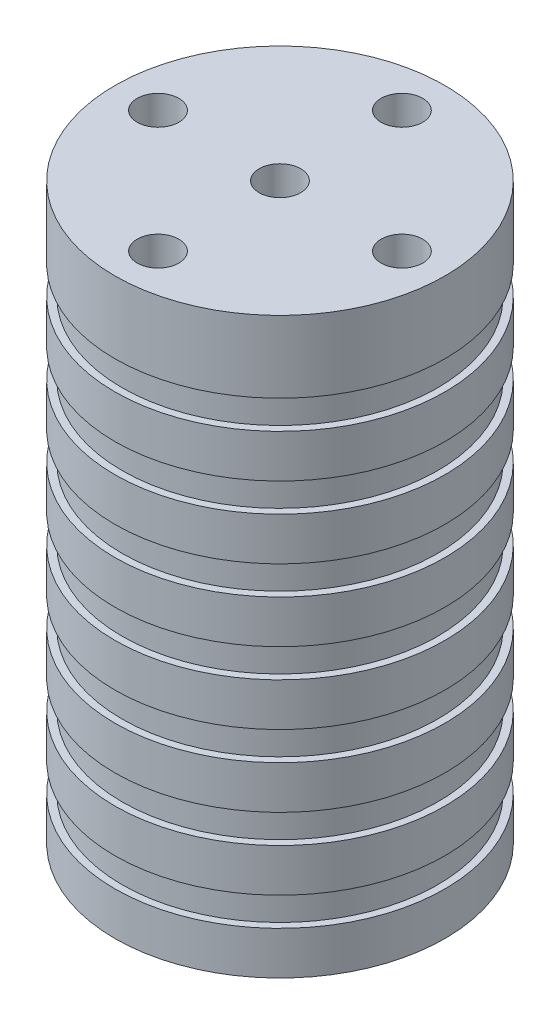
ISO-10303-21;
HEADER;
FILE_DESCRIPTION(('STEP AP214'),'2;1');
FILE_NAME('part.step','',(''),(''),'','','');
FILE_SCHEMA(('AUTOMOTIVE_DESIGN { 1 0 10303 214 1 1 1 1 }'));
ENDSEC;
DATA;
#1=APPLICATION_CONTEXT('core data for automotive mechanical design processes');
#2=APPLICATION_PROTOCOL_DEFINITION('international standard','automotive_design',2000,#1);
#3=PRODUCT_CONTEXT('',#1,'mechanical');
#4=PRODUCT('Part','Part','',(#3));
#5=PRODUCT_RELATED_PRODUCT_CATEGORY('part','',(#4));
#6=PRODUCT_DEFINITION_FORMATION('','',#4);
#7=PRODUCT_DEFINITION_CONTEXT('part definition',#1,'design');
#8=PRODUCT_DEFINITION('design','',#6,#7);
#9=PRODUCT_DEFINITION_SHAPE('','',#8);
#10=(LENGTH_UNIT() NAMED_UNIT(*) SI_UNIT(.MILLI.,.METRE.));
#11=(NAMED_UNIT(*) PLANE_ANGLE_UNIT() SI_UNIT($,.RADIAN.));
#12=(NAMED_UNIT(*) SI_UNIT($,.STERADIAN.) SOLID_ANGLE_UNIT());
#13=UNCERTAINTY_MEASURE_WITH_UNIT(LENGTH_MEASURE(1.E-05),#10,'distance_accuracy_value','');
#14=(GEOMETRIC_REPRESENTATION_CONTEXT(3) GLOBAL_UNCERTAINTY_ASSIGNED_CONTEXT((#13)) GLOBAL_UNIT_ASSIGNED_CONTEXT((#10,
#11,#12)) REPRESENTATION_CONTEXT('',''));
#15=CARTESIAN_POINT('',(0.,0.,0.));
#16=DIRECTION('',(0.,0.,1.));
#17=DIRECTION('',(1.,0.,0.));
#18=AXIS2_PLACEMENT_3D('',#15,#16,#17);
#19=CARTESIAN_POINT('',(0.,0.,0.));
#20=DIRECTION('',(0.,-1.,0.));
#21=DIRECTION('',(0.,0.,-1.));
#22=AXIS2_PLACEMENT_3D('',#19,#20,#21);
#23=PLANE('',#22);
#24=CARTESIAN_POINT('',(8.5,0.,0.));
#25=DIRECTION('',(0.,1.,0.));
#26=DIRECTION('',(0.,0.,1.));
#27=AXIS2_PLACEMENT_3D('',#24,#25,#26);
#28=CIRCLE('',#27,1.45);
#29=CARTESIAN_POINT('',(8.5,0.,1.44999999999999));
#30=VERTEX_POINT('',#29);
#31=EDGE_CURVE('E84',#30,#30,#28,.T.);
#32=ORIENTED_EDGE('',*,*,#31,.F.);
#33=EDGE_LOOP('',(#32));
#34=FACE_BOUND('',#33,.T.);
#35=CARTESIAN_POINT('',(0.,0.,0.));
#36=DIRECTION('',(0.,1.,0.));
#37=DIRECTION('',(0.,0.,1.));
#38=AXIS2_PLACEMENT_3D('',#35,#36,#37);
#39=CIRCLE('',#38,1.45);
#40=CARTESIAN_POINT('',(0.,0.,1.45));
#41=VERTEX_POINT('',#40);
#42=EDGE_CURVE('E83',#41,#41,#39,.T.);
#43=ORIENTED_EDGE('',*,*,#42,.F.);
#44=EDGE_LOOP('',(#43));
#45=FACE_BOUND('',#44,.T.);
#46=CARTESIAN_POINT('',(0.,0.,-8.5));
#47=DIRECTION('',(0.,1.,0.));
#48=DIRECTION('',(0.,0.,1.));
#49=AXIS2_PLACEMENT_3D('',#46,#47,#48);
#50=CIRCLE('',#49,1.45);
#51=CARTESIAN_POINT('',(0.,0.,-7.05));
#52=VERTEX_POINT('',#51);
#53=EDGE_CURVE('E100',#52,#52,#50,.T.);
#54=ORIENTED_EDGE('',*,*,#53,.F.);
#55=EDGE_LOOP('',(#54));
#56=FACE_BOUND('',#55,.T.);
#57=CARTESIAN_POINT('',(0.,0.,8.5));
#58=DIRECTION('',(0.,1.,0.));
#59=DIRECTION('',(0.,0.,1.));
#60=AXIS2_PLACEMENT_3D('',#57,#58,#59);
#61=CIRCLE('',#60,1.45);
#62=CARTESIAN_POINT('',(0.,0.,9.95));
#63=VERTEX_POINT('',#62);
#64=EDGE_CURVE('E106',#63,#63,#61,.T.);
#65=ORIENTED_EDGE('',*,*,#64,.F.);
#66=EDGE_LOOP('',(#65));
#67=FACE_BOUND('',#66,.T.);
#68=CARTESIAN_POINT('',(0.,0.,0.));
#69=DIRECTION('',(0.,1.,0.));
#70=DIRECTION('',(0.,0.,1.));
#71=AXIS2_PLACEMENT_3D('',#68,#69,#70);
#72=CIRCLE('',#71,11.5);
#73=CARTESIAN_POINT('',(0.,0.,11.5));
#74=VERTEX_POINT('',#73);
#75=EDGE_CURVE('E60',#74,#74,#72,.T.);
#76=ORIENTED_EDGE('',*,*,#75,.T.);
#77=EDGE_LOOP('',(#76));
#78=FACE_BOUND('',#77,.T.);
#79=CARTESIAN_POINT('',(-8.5,0.,0.));
#80=DIRECTION('',(0.,1.,0.));
#81=DIRECTION('',(0.,0.,1.));
#82=AXIS2_PLACEMENT_3D('',#79,#80,#81);
#83=CIRCLE('',#82,1.45);
#84=CARTESIAN_POINT('',(-8.5,0.,1.45));
#85=VERTEX_POINT('',#84);
#86=EDGE_CURVE('E94',#85,#85,#83,.T.);
#87=ORIENTED_EDGE('',*,*,#86,.F.);
#88=EDGE_LOOP('',(#87));
#89=FACE_BOUND('',#88,.T.);
#90=ADVANCED_FACE('F52',(#34,#45,#56,#67,#78,#89),#23,.F.);
#91=CARTESIAN_POINT('',(0.,0.,0.));
#92=DIRECTION('',(0.,1.,0.));
#93=DIRECTION('',(0.,0.,1.));
#94=AXIS2_PLACEMENT_3D('',#91,#92,#93);
#95=CYLINDRICAL_SURFACE('',#94,11.5);
#96=CARTESIAN_POINT('',(0.,-7.,0.));
#97=DIRECTION('',(0.,1.,0.));
#98=DIRECTION('',(0.,0.,1.));
#99=AXIS2_PLACEMENT_3D('',#96,#97,#98);
#100=CIRCLE('',#99,11.5);
#101=CARTESIAN_POINT('',(0.,-7.,11.5));
#102=VERTEX_POINT('',#101);
#103=EDGE_CURVE('E121',#102,#102,#100,.T.);
#104=ORIENTED_EDGE('',*,*,#103,.F.);
#105=EDGE_LOOP('',(#104));
#106=FACE_BOUND('',#105,.T.);
#107=CARTESIAN_POINT('',(0.,-9.99999999999999,0.));
#108=DIRECTION('',(0.,1.,0.));
#109=DIRECTION('',(0.,0.,1.));
#110=AXIS2_PLACEMENT_3D('',#107,#108,#109);
#111=CIRCLE('',#110,11.5);
#112=CARTESIAN_POINT('',(0.,-9.99999999999999,11.5));
#113=VERTEX_POINT('',#112);
#114=EDGE_CURVE('E124',#113,#113,#111,.T.);
#115=ORIENTED_EDGE('',*,*,#114,.T.);
#116=EDGE_LOOP('',(#115));
#117=FACE_BOUND('',#116,.T.);
#118=ADVANCED_FACE('F212',(#106,#117),#95,.T.);
#119=CARTESIAN_POINT('',(0.,-12.,0.));
#120=DIRECTION('',(0.,1.,0.));
#121=DIRECTION('',(0.,0.,1.));
#122=AXIS2_PLACEMENT_3D('',#119,#120,#121);
#123=CIRCLE('',#122,11.5);
#124=CARTESIAN_POINT('',(0.,-12.,11.5));
#125=VERTEX_POINT('',#124);
#126=EDGE_CURVE('E133',#125,#125,#123,.T.);
#127=ORIENTED_EDGE('',*,*,#126,.F.);
#128=EDGE_LOOP('',(#127));
#129=FACE_BOUND('',#128,.T.);
#130=CARTESIAN_POINT('',(0.,-15.,0.));
#131=DIRECTION('',(0.,1.,0.));
#132=DIRECTION('',(0.,0.,1.));
#133=AXIS2_PLACEMENT_3D('',#130,#131,#132);
#134=CIRCLE('',#133,11.5);
#135=CARTESIAN_POINT('',(0.,-15.,11.5));
#136=VERTEX_POINT('',#135);
#137=EDGE_CURVE('E136',#136,#136,#134,.T.);
#138=ORIENTED_EDGE('',*,*,#137,.T.);
#139=EDGE_LOOP('',(#138));
#140=FACE_BOUND('',#139,.T.);
#141=ADVANCED_FACE('F227',(#129,#140),#95,.T.);
#142=CARTESIAN_POINT('',(0.,-17.,0.));
#143=DIRECTION('',(0.,1.,0.));
#144=DIRECTION('',(0.,0.,1.));
#145=AXIS2_PLACEMENT_3D('',#142,#143,#144);
#146=CIRCLE('',#145,11.5);
#147=CARTESIAN_POINT('',(0.,-17.,11.5));
#148=VERTEX_POINT('',#147);
#149=EDGE_CURVE('E145',#148,#148,#146,.T.);
#150=ORIENTED_EDGE('',*,*,#149,.F.);
#151=EDGE_LOOP('',(#150));
#152=FACE_BOUND('',#151,.T.);
#153=CARTESIAN_POINT('',(0.,-20.,0.));
#154=DIRECTION('',(0.,1.,0.));
#155=DIRECTION('',(0.,0.,1.));
#156=AXIS2_PLACEMENT_3D('',#153,#154,#155);
#157=CIRCLE('',#156,11.5);
#158=CARTESIAN_POINT('',(0.,-20.,11.5));
#159=VERTEX_POINT('',#158);
#160=EDGE_CURVE('E148',#159,#159,#157,.T.);
#161=ORIENTED_EDGE('',*,*,#160,.T.);
#162=EDGE_LOOP('',(#161));
#163=FACE_BOUND('',#162,.T.);
#164=ADVANCED_FACE('F390',(#152,#163),#95,.T.);
#165=CARTESIAN_POINT('',(0.,-22.,0.));
#166=DIRECTION('',(0.,1.,0.));
#167=DIRECTION('',(0.,0.,1.));
#168=AXIS2_PLACEMENT_3D('',#165,#166,#167);
#169=CIRCLE('',#168,11.5);
#170=CARTESIAN_POINT('',(0.,-22.,11.5));
#171=VERTEX_POINT('',#170);
#172=EDGE_CURVE('E157',#171,#171,#169,.T.);
#173=ORIENTED_EDGE('',*,*,#172,.F.);
#174=EDGE_LOOP('',(#173));
#175=FACE_BOUND('',#174,.T.);
#176=CARTESIAN_POINT('',(0.,-25.,0.));
#177=DIRECTION('',(0.,1.,0.));
#178=DIRECTION('',(0.,0.,1.));
#179=AXIS2_PLACEMENT_3D('',#176,#177,#178);
#180=CIRCLE('',#179,11.5);
#181=CARTESIAN_POINT('',(0.,-25.,11.5));
#182=VERTEX_POINT('',#181);
#183=EDGE_CURVE('E160',#182,#182,#180,.T.);
#184=ORIENTED_EDGE('',*,*,#183,.T.);
#185=EDGE_LOOP('',(#184));
#186=FACE_BOUND('',#185,.T.);
#187=ADVANCED_FACE('F397',(#175,#186),#95,.T.);
#188=CARTESIAN_POINT('',(0.,-27.,0.));
#189=DIRECTION('',(0.,1.,0.));
#190=DIRECTION('',(0.,0.,1.));
#191=AXIS2_PLACEMENT_3D('',#188,#189,#190);
#192=CIRCLE('',#191,11.5);
#193=CARTESIAN_POINT('',(0.,-27.,11.5));
#194=VERTEX_POINT('',#193);
#195=EDGE_CURVE('E169',#194,#194,#192,.T.);
#196=ORIENTED_EDGE('',*,*,#195,.F.);
#197=EDGE_LOOP('',(#196));
#198=FACE_BOUND('',#197,.T.);
#199=CARTESIAN_POINT('',(0.,-30.,0.));
#200=DIRECTION('',(0.,1.,0.));
#201=DIRECTION('',(0.,0.,1.));
#202=AXIS2_PLACEMENT_3D('',#199,#200,#201);
#203=CIRCLE('',#202,11.5);
#204=CARTESIAN_POINT('',(0.,-30.,11.5));
#205=VERTEX_POINT('',#204);
#206=EDGE_CURVE('E172',#205,#205,#203,.T.);
#207=ORIENTED_EDGE('',*,*,#206,.T.);
#208=EDGE_LOOP('',(#207));
#209=FACE_BOUND('',#208,.T.);
#210=ADVANCED_FACE('F404',(#198,#209),#95,.T.);
#211=CARTESIAN_POINT('',(0.,-32.,0.));
#212=DIRECTION('',(0.,1.,0.));
#213=DIRECTION('',(0.,0.,1.));
#214=AXIS2_PLACEMENT_3D('',#211,#212,#213);
#215=CIRCLE('',#214,11.5);
#216=CARTESIAN_POINT('',(0.,-32.,11.5));
#217=VERTEX_POINT('',#216);
#218=EDGE_CURVE('E181',#217,#217,#215,.T.);
#219=ORIENTED_EDGE('',*,*,#218,.F.);
#220=EDGE_LOOP('',(#219));
#221=FACE_BOUND('',#220,.T.);
#222=CARTESIAN_POINT('',(0.,-35.,0.));
#223=DIRECTION('',(0.,1.,0.));
#224=DIRECTION('',(0.,0.,1.));
#225=AXIS2_PLACEMENT_3D('',#222,#223,#224);
#226=CIRCLE('',#225,11.5);
#227=CARTESIAN_POINT('',(0.,-35.,11.5));
#228=VERTEX_POINT('',#227);
#229=EDGE_CURVE('E184',#228,#228,#226,.T.);
#230=ORIENTED_EDGE('',*,*,#229,.T.);
#231=EDGE_LOOP('',(#230));
#232=FACE_BOUND('',#231,.T.);
#233=ADVANCED_FACE('F230',(#221,#232),#95,.T.);
#234=CARTESIAN_POINT('',(0.,-37.,0.));
#235=DIRECTION('',(0.,1.,0.));
#236=DIRECTION('',(0.,0.,1.));
#237=AXIS2_PLACEMENT_3D('',#234,#235,#236);
#238=CIRCLE('',#237,11.5);
#239=CARTESIAN_POINT('',(0.,-37.,11.5));
#240=VERTEX_POINT('',#239);
#241=EDGE_CURVE('E193',#240,#240,#238,.T.);
#242=ORIENTED_EDGE('',*,*,#241,.F.);
#243=EDGE_LOOP('',(#242));
#244=FACE_BOUND('',#243,.T.);
#245=CARTESIAN_POINT('',(0.,-40.,0.));
#246=DIRECTION('',(0.,1.,0.));
#247=DIRECTION('',(0.,0.,1.));
#248=AXIS2_PLACEMENT_3D('',#245,#246,#247);
#249=CIRCLE('',#248,11.5);
#250=CARTESIAN_POINT('',(0.,-40.,11.5));
#251=VERTEX_POINT('',#250);
#252=EDGE_CURVE('E199',#251,#251,#249,.T.);
#253=ORIENTED_EDGE('',*,*,#252,.T.);
#254=EDGE_LOOP('',(#253));
#255=FACE_BOUND('',#254,.T.);
#256=ADVANCED_FACE('F213',(#244,#255),#95,.T.);
#257=CARTESIAN_POINT('',(0.,0.,0.));
#258=DIRECTION('',(0.,1.,0.));
#259=DIRECTION('',(0.,0.,1.));
#260=AXIS2_PLACEMENT_3D('',#257,#258,#259);
#261=CYLINDRICAL_SURFACE('',#260,5.5);
#262=CARTESIAN_POINT('',(0.,-7.,0.));
#263=DIRECTION('',(0.,1.,0.));
#264=DIRECTION('',(0.,0.,1.));
#265=AXIS2_PLACEMENT_3D('',#262,#263,#264);
#266=CIRCLE('',#265,5.5);
#267=CARTESIAN_POINT('',(0.,-7.,5.5));
#268=VERTEX_POINT('',#267);
#269=EDGE_CURVE('E11',#268,#268,#266,.T.);
#270=ORIENTED_EDGE('',*,*,#269,.T.);
#271=EDGE_LOOP('',(#270));
#272=FACE_BOUND('',#271,.T.);
#273=CARTESIAN_POINT('',(0.,-40.,0.));
#274=DIRECTION('',(0.,1.,0.));
#275=DIRECTION('',(0.,0.,1.));
#276=AXIS2_PLACEMENT_3D('',#273,#274,#275);
#277=CIRCLE('',#276,5.49999999999999);
#278=CARTESIAN_POINT('',(0.,-40.,5.49999999999999));
#279=VERTEX_POINT('',#278);
#280=EDGE_CURVE('E196',#279,#279,#277,.T.);
#281=ORIENTED_EDGE('',*,*,#280,.F.);
#282=EDGE_LOOP('',(#281));
#283=FACE_BOUND('',#282,.T.);
#284=ADVANCED_FACE('F54',(#272,#283),#261,.F.);
#285=CARTESIAN_POINT('',(0.,-7.,0.));
#286=DIRECTION('',(0.,-1.,0.));
#287=DIRECTION('',(0.,0.,-1.));
#288=AXIS2_PLACEMENT_3D('',#285,#286,#287);
#289=PLANE('',#288);
#290=CARTESIAN_POINT('',(0.,-7.,0.));
#291=DIRECTION('',(0.,-1.,0.));
#292=DIRECTION('',(0.,0.,-1.));
#293=AXIS2_PLACEMENT_3D('',#290,#291,#292);
#294=CIRCLE('',#293,1.45);
#295=CARTESIAN_POINT('',(0.,-7.,-1.45));
#296=VERTEX_POINT('',#295);
#297=EDGE_CURVE('E87',#296,#296,#294,.T.);
#298=ORIENTED_EDGE('',*,*,#297,.F.);
#299=EDGE_LOOP('',(#298));
#300=FACE_BOUND('',#299,.T.);
#301=ORIENTED_EDGE('',*,*,#269,.F.);
#302=EDGE_LOOP('',(#301));
#303=FACE_BOUND('',#302,.T.);
#304=ADVANCED_FACE('F239',(#300,#303),#289,.T.);
#305=CARTESIAN_POINT('',(0.,-40.,0.));
#306=DIRECTION('',(0.,-1.,0.));
#307=DIRECTION('',(0.,0.,-1.));
#308=AXIS2_PLACEMENT_3D('',#305,#306,#307);
#309=PLANE('',#308);
#310=ORIENTED_EDGE('',*,*,#280,.T.);
#311=EDGE_LOOP('',(#310));
#312=FACE_BOUND('',#311,.T.);
#313=ORIENTED_EDGE('',*,*,#252,.F.);
#314=EDGE_LOOP('',(#313));
#315=FACE_BOUND('',#314,.T.);
#316=ADVANCED_FACE('F241',(#312,#315),#309,.T.);
#317=CARTESIAN_POINT('',(11.5,-37.,0.));
#318=DIRECTION('',(0.,-1.,0.));
#319=DIRECTION('',(0.,0.,-1.));
#320=AXIS2_PLACEMENT_3D('',#317,#318,#319);
#321=PLANE('',#320);
#322=CARTESIAN_POINT('',(0.,-37.,0.));
#323=DIRECTION('',(0.,1.,0.));
#324=DIRECTION('',(0.,0.,1.));
#325=AXIS2_PLACEMENT_3D('',#322,#323,#324);
#326=CIRCLE('',#325,11.);
#327=CARTESIAN_POINT('',(0.,-37.,11.));
#328=VERTEX_POINT('',#327);
#329=EDGE_CURVE('E190',#328,#328,#326,.T.);
#330=ORIENTED_EDGE('',*,*,#329,.F.);
#331=EDGE_LOOP('',(#330));
#332=FACE_BOUND('',#331,.T.);
#333=ORIENTED_EDGE('',*,*,#241,.T.);
#334=EDGE_LOOP('',(#333));
#335=FACE_BOUND('',#334,.T.);
#336=ADVANCED_FACE('F246',(#332,#335),#321,.F.);
#337=CARTESIAN_POINT('',(0.,0.,0.));
#338=DIRECTION('',(0.,1.,0.));
#339=DIRECTION('',(0.,0.,1.));
#340=AXIS2_PLACEMENT_3D('',#337,#338,#339);
#341=CYLINDRICAL_SURFACE('',#340,11.);
#342=CARTESIAN_POINT('',(0.,-35.,0.));
#343=DIRECTION('',(0.,1.,0.));
#344=DIRECTION('',(0.,0.,1.));
#345=AXIS2_PLACEMENT_3D('',#342,#343,#344);
#346=CIRCLE('',#345,11.);
#347=CARTESIAN_POINT('',(0.,-35.,11.));
#348=VERTEX_POINT('',#347);
#349=EDGE_CURVE('E187',#348,#348,#346,.T.);
#350=ORIENTED_EDGE('',*,*,#349,.F.);
#351=EDGE_LOOP('',(#350));
#352=FACE_BOUND('',#351,.T.);
#353=ORIENTED_EDGE('',*,*,#329,.T.);
#354=EDGE_LOOP('',(#353));
#355=FACE_BOUND('',#354,.T.);
#356=ADVANCED_FACE('F351',(#352,#355),#341,.T.);
#357=CARTESIAN_POINT('',(11.,-35.,0.));
#358=DIRECTION('',(0.,1.,0.));
#359=DIRECTION('',(0.,0.,1.));
#360=AXIS2_PLACEMENT_3D('',#357,#358,#359);
#361=PLANE('',#360);
#362=ORIENTED_EDGE('',*,*,#229,.F.);
#363=EDGE_LOOP('',(#362));
#364=FACE_BOUND('',#363,.T.);
#365=ORIENTED_EDGE('',*,*,#349,.T.);
#366=EDGE_LOOP('',(#365));
#367=FACE_BOUND('',#366,.T.);
#368=ADVANCED_FACE('F347',(#364,#367),#361,.F.);
#369=CARTESIAN_POINT('',(11.5,-32.,0.));
#370=DIRECTION('',(0.,-1.,0.));
#371=DIRECTION('',(0.,0.,-1.));
#372=AXIS2_PLACEMENT_3D('',#369,#370,#371);
#373=PLANE('',#372);
#374=CARTESIAN_POINT('',(0.,-32.,0.));
#375=DIRECTION('',(0.,1.,0.));
#376=DIRECTION('',(0.,0.,1.));
#377=AXIS2_PLACEMENT_3D('',#374,#375,#376);
#378=CIRCLE('',#377,11.);
#379=CARTESIAN_POINT('',(0.,-32.,11.));
#380=VERTEX_POINT('',#379);
#381=EDGE_CURVE('E178',#380,#380,#378,.T.);
#382=ORIENTED_EDGE('',*,*,#381,.F.);
#383=EDGE_LOOP('',(#382));
#384=FACE_BOUND('',#383,.T.);
#385=ORIENTED_EDGE('',*,*,#218,.T.);
#386=EDGE_LOOP('',(#385));
#387=FACE_BOUND('',#386,.T.);
#388=ADVANCED_FACE('F343',(#384,#387),#373,.F.);
#389=CARTESIAN_POINT('',(0.,5.,0.));
#390=DIRECTION('',(0.,1.,0.));
#391=DIRECTION('',(0.,0.,1.));
#392=AXIS2_PLACEMENT_3D('',#389,#390,#391);
#393=CYLINDRICAL_SURFACE('',#392,11.);
#394=CARTESIAN_POINT('',(0.,-30.,0.));
#395=DIRECTION('',(0.,1.,0.));
#396=DIRECTION('',(0.,0.,1.));
#397=AXIS2_PLACEMENT_3D('',#394,#395,#396);
#398=CIRCLE('',#397,11.);
#399=CARTESIAN_POINT('',(0.,-30.,11.));
#400=VERTEX_POINT('',#399);
#401=EDGE_CURVE('E175',#400,#400,#398,.T.);
#402=ORIENTED_EDGE('',*,*,#401,.F.);
#403=EDGE_LOOP('',(#402));
#404=FACE_BOUND('',#403,.T.);
#405=ORIENTED_EDGE('',*,*,#381,.T.);
#406=EDGE_LOOP('',(#405));
#407=FACE_BOUND('',#406,.T.);
#408=ADVANCED_FACE('F339',(#404,#407),#393,.T.);
#409=CARTESIAN_POINT('',(11.,-30.,0.));
#410=DIRECTION('',(0.,1.,0.));
#411=DIRECTION('',(0.,0.,1.));
#412=AXIS2_PLACEMENT_3D('',#409,#410,#411);
#413=PLANE('',#412);
#414=ORIENTED_EDGE('',*,*,#206,.F.);
#415=EDGE_LOOP('',(#414));
#416=FACE_BOUND('',#415,.T.);
#417=ORIENTED_EDGE('',*,*,#401,.T.);
#418=EDGE_LOOP('',(#417));
#419=FACE_BOUND('',#418,.T.);
#420=ADVANCED_FACE('F335',(#416,#419),#413,.F.);
#421=CARTESIAN_POINT('',(11.5,-27.,0.));
#422=DIRECTION('',(0.,-1.,0.));
#423=DIRECTION('',(0.,0.,-1.));
#424=AXIS2_PLACEMENT_3D('',#421,#422,#423);
#425=PLANE('',#424);
#426=CARTESIAN_POINT('',(0.,-27.,0.));
#427=DIRECTION('',(0.,1.,0.));
#428=DIRECTION('',(0.,0.,1.));
#429=AXIS2_PLACEMENT_3D('',#426,#427,#428);
#430=CIRCLE('',#429,11.);
#431=CARTESIAN_POINT('',(0.,-27.,11.));
#432=VERTEX_POINT('',#431);
#433=EDGE_CURVE('E166',#432,#432,#430,.T.);
#434=ORIENTED_EDGE('',*,*,#433,.F.);
#435=EDGE_LOOP('',(#434));
#436=FACE_BOUND('',#435,.T.);
#437=ORIENTED_EDGE('',*,*,#195,.T.);
#438=EDGE_LOOP('',(#437));
#439=FACE_BOUND('',#438,.T.);
#440=ADVANCED_FACE('F331',(#436,#439),#425,.F.);
#441=CARTESIAN_POINT('',(0.,10.,0.));
#442=DIRECTION('',(0.,1.,0.));
#443=DIRECTION('',(0.,0.,1.));
#444=AXIS2_PLACEMENT_3D('',#441,#442,#443);
#445=CYLINDRICAL_SURFACE('',#444,11.);
#446=CARTESIAN_POINT('',(0.,-25.,0.));
#447=DIRECTION('',(0.,1.,0.));
#448=DIRECTION('',(0.,0.,1.));
#449=AXIS2_PLACEMENT_3D('',#446,#447,#448);
#450=CIRCLE('',#449,11.);
#451=CARTESIAN_POINT('',(0.,-25.,11.));
#452=VERTEX_POINT('',#451);
#453=EDGE_CURVE('E163',#452,#452,#450,.T.);
#454=ORIENTED_EDGE('',*,*,#453,.F.);
#455=EDGE_LOOP('',(#454));
#456=FACE_BOUND('',#455,.T.);
#457=ORIENTED_EDGE('',*,*,#433,.T.);
#458=EDGE_LOOP('',(#457));
#459=FACE_BOUND('',#458,.T.);
#460=ADVANCED_FACE('F327',(#456,#459),#445,.T.);
#461=CARTESIAN_POINT('',(11.,-25.,0.));
#462=DIRECTION('',(0.,1.,0.));
#463=DIRECTION('',(0.,0.,1.));
#464=AXIS2_PLACEMENT_3D('',#461,#462,#463);
#465=PLANE('',#464);
#466=ORIENTED_EDGE('',*,*,#183,.F.);
#467=EDGE_LOOP('',(#466));
#468=FACE_BOUND('',#467,.T.);
#469=ORIENTED_EDGE('',*,*,#453,.T.);
#470=EDGE_LOOP('',(#469));
#471=FACE_BOUND('',#470,.T.);
#472=ADVANCED_FACE('F323',(#468,#471),#465,.F.);
#473=CARTESIAN_POINT('',(11.5,-22.,0.));
#474=DIRECTION('',(0.,-1.,0.));
#475=DIRECTION('',(0.,0.,-1.));
#476=AXIS2_PLACEMENT_3D('',#473,#474,#475);
#477=PLANE('',#476);
#478=CARTESIAN_POINT('',(0.,-22.,0.));
#479=DIRECTION('',(0.,1.,0.));
#480=DIRECTION('',(0.,0.,1.));
#481=AXIS2_PLACEMENT_3D('',#478,#479,#480);
#482=CIRCLE('',#481,11.);
#483=CARTESIAN_POINT('',(0.,-22.,11.));
#484=VERTEX_POINT('',#483);
#485=EDGE_CURVE('E154',#484,#484,#482,.T.);
#486=ORIENTED_EDGE('',*,*,#485,.F.);
#487=EDGE_LOOP('',(#486));
#488=FACE_BOUND('',#487,.T.);
#489=ORIENTED_EDGE('',*,*,#172,.T.);
#490=EDGE_LOOP('',(#489));
#491=FACE_BOUND('',#490,.T.);
#492=ADVANCED_FACE('F319',(#488,#491),#477,.F.);
#493=CARTESIAN_POINT('',(0.,15.,0.));
#494=DIRECTION('',(0.,1.,0.));
#495=DIRECTION('',(0.,0.,1.));
#496=AXIS2_PLACEMENT_3D('',#493,#494,#495);
#497=CYLINDRICAL_SURFACE('',#496,11.);
#498=CARTESIAN_POINT('',(0.,-20.,0.));
#499=DIRECTION('',(0.,1.,0.));
#500=DIRECTION('',(0.,0.,1.));
#501=AXIS2_PLACEMENT_3D('',#498,#499,#500);
#502=CIRCLE('',#501,11.);
#503=CARTESIAN_POINT('',(0.,-20.,11.));
#504=VERTEX_POINT('',#503);
#505=EDGE_CURVE('E151',#504,#504,#502,.T.);
#506=ORIENTED_EDGE('',*,*,#505,.F.);
#507=EDGE_LOOP('',(#506));
#508=FACE_BOUND('',#507,.T.);
#509=ORIENTED_EDGE('',*,*,#485,.T.);
#510=EDGE_LOOP('',(#509));
#511=FACE_BOUND('',#510,.T.);
#512=ADVANCED_FACE('F315',(#508,#511),#497,.T.);
#513=CARTESIAN_POINT('',(11.,-20.,0.));
#514=DIRECTION('',(0.,1.,0.));
#515=DIRECTION('',(0.,0.,1.));
#516=AXIS2_PLACEMENT_3D('',#513,#514,#515);
#517=PLANE('',#516);
#518=ORIENTED_EDGE('',*,*,#160,.F.);
#519=EDGE_LOOP('',(#518));
#520=FACE_BOUND('',#519,.T.);
#521=ORIENTED_EDGE('',*,*,#505,.T.);
#522=EDGE_LOOP('',(#521));
#523=FACE_BOUND('',#522,.T.);
#524=ADVANCED_FACE('F311',(#520,#523),#517,.F.);
#525=CARTESIAN_POINT('',(11.5,-17.,0.));
#526=DIRECTION('',(0.,-1.,0.));
#527=DIRECTION('',(0.,0.,-1.));
#528=AXIS2_PLACEMENT_3D('',#525,#526,#527);
#529=PLANE('',#528);
#530=CARTESIAN_POINT('',(0.,-17.,0.));
#531=DIRECTION('',(0.,1.,0.));
#532=DIRECTION('',(0.,0.,1.));
#533=AXIS2_PLACEMENT_3D('',#530,#531,#532);
#534=CIRCLE('',#533,11.);
#535=CARTESIAN_POINT('',(0.,-17.,11.));
#536=VERTEX_POINT('',#535);
#537=EDGE_CURVE('E142',#536,#536,#534,.T.);
#538=ORIENTED_EDGE('',*,*,#537,.F.);
#539=EDGE_LOOP('',(#538));
#540=FACE_BOUND('',#539,.T.);
#541=ORIENTED_EDGE('',*,*,#149,.T.);
#542=EDGE_LOOP('',(#541));
#543=FACE_BOUND('',#542,.T.);
#544=ADVANCED_FACE('F307',(#540,#543),#529,.F.);
#545=CARTESIAN_POINT('',(0.,20.,0.));
#546=DIRECTION('',(0.,1.,0.));
#547=DIRECTION('',(0.,0.,1.));
#548=AXIS2_PLACEMENT_3D('',#545,#546,#547);
#549=CYLINDRICAL_SURFACE('',#548,11.);
#550=CARTESIAN_POINT('',(0.,-15.,0.));
#551=DIRECTION('',(0.,1.,0.));
#552=DIRECTION('',(0.,0.,1.));
#553=AXIS2_PLACEMENT_3D('',#550,#551,#552);
#554=CIRCLE('',#553,11.);
#555=CARTESIAN_POINT('',(0.,-15.,11.));
#556=VERTEX_POINT('',#555);
#557=EDGE_CURVE('E139',#556,#556,#554,.T.);
#558=ORIENTED_EDGE('',*,*,#557,.F.);
#559=EDGE_LOOP('',(#558));
#560=FACE_BOUND('',#559,.T.);
#561=ORIENTED_EDGE('',*,*,#537,.T.);
#562=EDGE_LOOP('',(#561));
#563=FACE_BOUND('',#562,.T.);
#564=ADVANCED_FACE('F303',(#560,#563),#549,.T.);
#565=CARTESIAN_POINT('',(11.,-15.,0.));
#566=DIRECTION('',(0.,1.,0.));
#567=DIRECTION('',(0.,0.,1.));
#568=AXIS2_PLACEMENT_3D('',#565,#566,#567);
#569=PLANE('',#568);
#570=ORIENTED_EDGE('',*,*,#137,.F.);
#571=EDGE_LOOP('',(#570));
#572=FACE_BOUND('',#571,.T.);
#573=ORIENTED_EDGE('',*,*,#557,.T.);
#574=EDGE_LOOP('',(#573));
#575=FACE_BOUND('',#574,.T.);
#576=ADVANCED_FACE('F299',(#572,#575),#569,.F.);
#577=CARTESIAN_POINT('',(11.5,-12.,0.));
#578=DIRECTION('',(0.,-1.,0.));
#579=DIRECTION('',(0.,0.,-1.));
#580=AXIS2_PLACEMENT_3D('',#577,#578,#579);
#581=PLANE('',#580);
#582=CARTESIAN_POINT('',(0.,-12.,0.));
#583=DIRECTION('',(0.,1.,0.));
#584=DIRECTION('',(0.,0.,1.));
#585=AXIS2_PLACEMENT_3D('',#582,#583,#584);
#586=CIRCLE('',#585,11.);
#587=CARTESIAN_POINT('',(0.,-12.,11.));
#588=VERTEX_POINT('',#587);
#589=EDGE_CURVE('E130',#588,#588,#586,.T.);
#590=ORIENTED_EDGE('',*,*,#589,.F.);
#591=EDGE_LOOP('',(#590));
#592=FACE_BOUND('',#591,.T.);
#593=ORIENTED_EDGE('',*,*,#126,.T.);
#594=EDGE_LOOP('',(#593));
#595=FACE_BOUND('',#594,.T.);
#596=ADVANCED_FACE('F295',(#592,#595),#581,.F.);
#597=CARTESIAN_POINT('',(0.,25.,0.));
#598=DIRECTION('',(0.,1.,0.));
#599=DIRECTION('',(0.,0.,1.));
#600=AXIS2_PLACEMENT_3D('',#597,#598,#599);
#601=CYLINDRICAL_SURFACE('',#600,11.);
#602=CARTESIAN_POINT('',(0.,-9.99999999999999,0.));
#603=DIRECTION('',(0.,1.,0.));
#604=DIRECTION('',(0.,0.,1.));
#605=AXIS2_PLACEMENT_3D('',#602,#603,#604);
#606=CIRCLE('',#605,11.);
#607=CARTESIAN_POINT('',(0.,-9.99999999999999,11.));
#608=VERTEX_POINT('',#607);
#609=EDGE_CURVE('E127',#608,#608,#606,.T.);
#610=ORIENTED_EDGE('',*,*,#609,.F.);
#611=EDGE_LOOP('',(#610));
#612=FACE_BOUND('',#611,.T.);
#613=ORIENTED_EDGE('',*,*,#589,.T.);
#614=EDGE_LOOP('',(#613));
#615=FACE_BOUND('',#614,.T.);
#616=ADVANCED_FACE('F291',(#612,#615),#601,.T.);
#617=CARTESIAN_POINT('',(11.,-9.99999999999999,0.));
#618=DIRECTION('',(0.,1.,0.));
#619=DIRECTION('',(0.,0.,1.));
#620=AXIS2_PLACEMENT_3D('',#617,#618,#619);
#621=PLANE('',#620);
#622=ORIENTED_EDGE('',*,*,#114,.F.);
#623=EDGE_LOOP('',(#622));
#624=FACE_BOUND('',#623,.T.);
#625=ORIENTED_EDGE('',*,*,#609,.T.);
#626=EDGE_LOOP('',(#625));
#627=FACE_BOUND('',#626,.T.);
#628=ADVANCED_FACE('F287',(#624,#627),#621,.F.);
#629=CARTESIAN_POINT('',(11.5,-7.,0.));
#630=DIRECTION('',(0.,-1.,0.));
#631=DIRECTION('',(0.,0.,-1.));
#632=AXIS2_PLACEMENT_3D('',#629,#630,#631);
#633=PLANE('',#632);
#634=CARTESIAN_POINT('',(0.,-7.,0.));
#635=DIRECTION('',(0.,1.,0.));
#636=DIRECTION('',(0.,0.,1.));
#637=AXIS2_PLACEMENT_3D('',#634,#635,#636);
#638=CIRCLE('',#637,11.);
#639=CARTESIAN_POINT('',(0.,-7.,11.));
#640=VERTEX_POINT('',#639);
#641=EDGE_CURVE('E118',#640,#640,#638,.T.);
#642=ORIENTED_EDGE('',*,*,#641,.F.);
#643=EDGE_LOOP('',(#642));
#644=FACE_BOUND('',#643,.T.);
#645=ORIENTED_EDGE('',*,*,#103,.T.);
#646=EDGE_LOOP('',(#645));
#647=FACE_BOUND('',#646,.T.);
#648=ADVANCED_FACE('F283',(#644,#647),#633,.F.);
#649=CARTESIAN_POINT('',(0.,30.,0.));
#650=DIRECTION('',(0.,1.,0.));
#651=DIRECTION('',(0.,0.,1.));
#652=AXIS2_PLACEMENT_3D('',#649,#650,#651);
#653=CYLINDRICAL_SURFACE('',#652,11.);
#654=CARTESIAN_POINT('',(0.,-5.,0.));
#655=DIRECTION('',(0.,1.,0.));
#656=DIRECTION('',(0.,0.,1.));
#657=AXIS2_PLACEMENT_3D('',#654,#655,#656);
#658=CIRCLE('',#657,11.);
#659=CARTESIAN_POINT('',(0.,-5.,11.));
#660=VERTEX_POINT('',#659);
#661=EDGE_CURVE('E115',#660,#660,#658,.T.);
#662=ORIENTED_EDGE('',*,*,#661,.F.);
#663=EDGE_LOOP('',(#662));
#664=FACE_BOUND('',#663,.T.);
#665=ORIENTED_EDGE('',*,*,#641,.T.);
#666=EDGE_LOOP('',(#665));
#667=FACE_BOUND('',#666,.T.);
#668=ADVANCED_FACE('F221',(#664,#667),#653,.T.);
#669=CARTESIAN_POINT('',(11.,-5.,0.));
#670=DIRECTION('',(0.,1.,0.));
#671=DIRECTION('',(0.,0.,1.));
#672=AXIS2_PLACEMENT_3D('',#669,#670,#671);
#673=PLANE('',#672);
#674=CARTESIAN_POINT('',(0.,-5.,0.));
#675=DIRECTION('',(0.,1.,0.));
#676=DIRECTION('',(0.,0.,1.));
#677=AXIS2_PLACEMENT_3D('',#674,#675,#676);
#678=CIRCLE('',#677,11.5);
#679=CARTESIAN_POINT('',(0.,-5.,11.5));
#680=VERTEX_POINT('',#679);
#681=EDGE_CURVE('E112',#680,#680,#678,.T.);
#682=ORIENTED_EDGE('',*,*,#681,.F.);
#683=EDGE_LOOP('',(#682));
#684=FACE_BOUND('',#683,.T.);
#685=ORIENTED_EDGE('',*,*,#661,.T.);
#686=EDGE_LOOP('',(#685));
#687=FACE_BOUND('',#686,.T.);
#688=ADVANCED_FACE('F209',(#684,#687),#673,.F.);
#689=ORIENTED_EDGE('',*,*,#681,.T.);
#690=EDGE_LOOP('',(#689));
#691=FACE_BOUND('',#690,.T.);
#692=ORIENTED_EDGE('',*,*,#75,.F.);
#693=EDGE_LOOP('',(#692));
#694=FACE_BOUND('',#693,.T.);
#695=ADVANCED_FACE('F206',(#691,#694),#95,.T.);
#696=CARTESIAN_POINT('',(0.,-10.,8.5));
#697=DIRECTION('',(0.,1.,0.));
#698=DIRECTION('',(0.,0.,1.));
#699=AXIS2_PLACEMENT_3D('',#696,#697,#698);
#700=CONICAL_SURFACE('',#699,1.45,1.02974425867665);
#701=CARTESIAN_POINT('',(0.,-10.87124789759,8.5));
#702=VERTEX_POINT('',#701);
#703=VERTEX_LOOP('',#702);
#704=FACE_BOUND('',#703,.T.);
#705=CARTESIAN_POINT('',(0.,-10.,8.5));
#706=DIRECTION('',(0.,1.,0.));
#707=DIRECTION('',(0.,0.,1.));
#708=AXIS2_PLACEMENT_3D('',#705,#706,#707);
#709=CIRCLE('',#708,1.45);
#710=CARTESIAN_POINT('',(0.,-10.,9.95));
#711=VERTEX_POINT('',#710);
#712=EDGE_CURVE('E109',#711,#711,#709,.T.);
#713=ORIENTED_EDGE('',*,*,#712,.T.);
#714=EDGE_LOOP('',(#713));
#715=FACE_BOUND('',#714,.T.);
#716=ADVANCED_FACE('F208',(#704,#715),#700,.F.);
#717=CARTESIAN_POINT('',(0.,0.,8.5));
#718=DIRECTION('',(0.,1.,0.));
#719=DIRECTION('',(0.,0.,1.));
#720=AXIS2_PLACEMENT_3D('',#717,#718,#719);
#721=CYLINDRICAL_SURFACE('',#720,1.45);
#722=ORIENTED_EDGE('',*,*,#712,.F.);
#723=EDGE_LOOP('',(#722));
#724=FACE_BOUND('',#723,.T.);
#725=ORIENTED_EDGE('',*,*,#64,.T.);
#726=EDGE_LOOP('',(#725));
#727=FACE_BOUND('',#726,.T.);
#728=ADVANCED_FACE('F219',(#724,#727),#721,.F.);
#729=CARTESIAN_POINT('',(0.,-10.,-8.5));
#730=DIRECTION('',(0.,1.,0.));
#731=DIRECTION('',(0.,0.,1.));
#732=AXIS2_PLACEMENT_3D('',#729,#730,#731);
#733=CONICAL_SURFACE('',#732,1.45,1.02974425867665);
#734=CARTESIAN_POINT('',(0.,-10.87124789759,-8.5));
#735=VERTEX_POINT('',#734);
#736=VERTEX_LOOP('',#735);
#737=FACE_BOUND('',#736,.T.);
#738=CARTESIAN_POINT('',(0.,-10.,-8.5));
#739=DIRECTION('',(0.,1.,0.));
#740=DIRECTION('',(0.,0.,1.));
#741=AXIS2_PLACEMENT_3D('',#738,#739,#740);
#742=CIRCLE('',#741,1.45);
#743=CARTESIAN_POINT('',(0.,-10.,-7.05));
#744=VERTEX_POINT('',#743);
#745=EDGE_CURVE('E103',#744,#744,#742,.T.);
#746=ORIENTED_EDGE('',*,*,#745,.T.);
#747=EDGE_LOOP('',(#746));
#748=FACE_BOUND('',#747,.T.);
#749=ADVANCED_FACE('F269',(#737,#748),#733,.F.);
#750=CARTESIAN_POINT('',(0.,0.,-8.5));
#751=DIRECTION('',(0.,1.,0.));
#752=DIRECTION('',(0.,0.,1.));
#753=AXIS2_PLACEMENT_3D('',#750,#751,#752);
#754=CYLINDRICAL_SURFACE('',#753,1.45);
#755=ORIENTED_EDGE('',*,*,#745,.F.);
#756=EDGE_LOOP('',(#755));
#757=FACE_BOUND('',#756,.T.);
#758=ORIENTED_EDGE('',*,*,#53,.T.);
#759=EDGE_LOOP('',(#758));
#760=FACE_BOUND('',#759,.T.);
#761=ADVANCED_FACE('F276',(#757,#760),#754,.F.);
#762=CARTESIAN_POINT('',(-8.5,-10.,0.));
#763=DIRECTION('',(0.,1.,0.));
#764=DIRECTION('',(0.,0.,1.));
#765=AXIS2_PLACEMENT_3D('',#762,#763,#764);
#766=CONICAL_SURFACE('',#765,1.45,1.02974425867665);
#767=CARTESIAN_POINT('',(-8.5,-10.87124789759,0.));
#768=VERTEX_POINT('',#767);
#769=VERTEX_LOOP('',#768);
#770=FACE_BOUND('',#769,.T.);
#771=CARTESIAN_POINT('',(-8.5,-10.,0.));
#772=DIRECTION('',(0.,1.,0.));
#773=DIRECTION('',(0.,0.,1.));
#774=AXIS2_PLACEMENT_3D('',#771,#772,#773);
#775=CIRCLE('',#774,1.45);
#776=CARTESIAN_POINT('',(-8.5,-10.,1.45));
#777=VERTEX_POINT('',#776);
#778=EDGE_CURVE('E97',#777,#777,#775,.T.);
#779=ORIENTED_EDGE('',*,*,#778,.T.);
#780=EDGE_LOOP('',(#779));
#781=FACE_BOUND('',#780,.T.);
#782=ADVANCED_FACE('F539',(#770,#781),#766,.F.);
#783=CARTESIAN_POINT('',(-8.5,0.,0.));
#784=DIRECTION('',(0.,1.,0.));
#785=DIRECTION('',(0.,0.,1.));
#786=AXIS2_PLACEMENT_3D('',#783,#784,#785);
#787=CYLINDRICAL_SURFACE('',#786,1.45);
#788=ORIENTED_EDGE('',*,*,#778,.F.);
#789=EDGE_LOOP('',(#788));
#790=FACE_BOUND('',#789,.T.);
#791=ORIENTED_EDGE('',*,*,#86,.T.);
#792=EDGE_LOOP('',(#791));
#793=FACE_BOUND('',#792,.T.);
#794=ADVANCED_FACE('F261',(#790,#793),#787,.F.);
#795=CARTESIAN_POINT('',(0.,0.,0.));
#796=DIRECTION('',(0.,1.,0.));
#797=DIRECTION('',(0.,0.,1.));
#798=AXIS2_PLACEMENT_3D('',#795,#796,#797);
#799=CYLINDRICAL_SURFACE('',#798,1.45);
#800=ORIENTED_EDGE('',*,*,#297,.T.);
#801=EDGE_LOOP('',(#800));
#802=FACE_BOUND('',#801,.T.);
#803=ORIENTED_EDGE('',*,*,#42,.T.);
#804=EDGE_LOOP('',(#803));
#805=FACE_BOUND('',#804,.T.);
#806=ADVANCED_FACE('F77',(#802,#805),#799,.F.);
#807=CARTESIAN_POINT('',(8.5,-10.,0.));
#808=DIRECTION('',(0.,1.,0.));
#809=DIRECTION('',(0.,0.,1.));
#810=AXIS2_PLACEMENT_3D('',#807,#808,#809);
#811=CONICAL_SURFACE('',#810,1.45,1.02974425867665);
#812=CARTESIAN_POINT('',(8.5,-10.87124789759,0.));
#813=VERTEX_POINT('',#812);
#814=VERTEX_LOOP('',#813);
#815=FACE_BOUND('',#814,.T.);
#816=CARTESIAN_POINT('',(8.5,-10.,0.));
#817=DIRECTION('',(0.,1.,0.));
#818=DIRECTION('',(0.,0.,1.));
#819=AXIS2_PLACEMENT_3D('',#816,#817,#818);
#820=CIRCLE('',#819,1.45);
#821=CARTESIAN_POINT('',(8.5,-10.,1.44999999999999));
#822=VERTEX_POINT('',#821);
#823=EDGE_CURVE('E81',#822,#822,#820,.T.);
#824=ORIENTED_EDGE('',*,*,#823,.T.);
#825=EDGE_LOOP('',(#824));
#826=FACE_BOUND('',#825,.T.);
#827=ADVANCED_FACE('F73',(#815,#826),#811,.F.);
#828=CARTESIAN_POINT('',(8.5,0.,0.));
#829=DIRECTION('',(0.,1.,0.));
#830=DIRECTION('',(0.,0.,1.));
#831=AXIS2_PLACEMENT_3D('',#828,#829,#830);
#832=CYLINDRICAL_SURFACE('',#831,1.45);
#833=ORIENTED_EDGE('',*,*,#823,.F.);
#834=EDGE_LOOP('',(#833));
#835=FACE_BOUND('',#834,.T.);
#836=ORIENTED_EDGE('',*,*,#31,.T.);
#837=EDGE_LOOP('',(#836));
#838=FACE_BOUND('',#837,.T.);
#839=ADVANCED_FACE('F76',(#835,#838),#832,.F.);
#840=CLOSED_SHELL('',(#90,#118,#141,#164,#187,#210,#233,#256,#284,#304,#316,#336,#356,#368,#388,
#408,#420,#440,#460,#472,#492,#512,#524,#544,#564,#576,#596,#616,#628,#648,#668,#688,#695,#716,
#728,#749,#761,#782,#794,#806,#827,#839));
#841=MANIFOLD_SOLID_BREP('B2',#840);
#842=ADVANCED_BREP_SHAPE_REPRESENTATION('',(#18,#841),#14);
#843=SHAPE_DEFINITION_REPRESENTATION(#9,#842);
ENDSEC;
END-ISO-10303-21;
